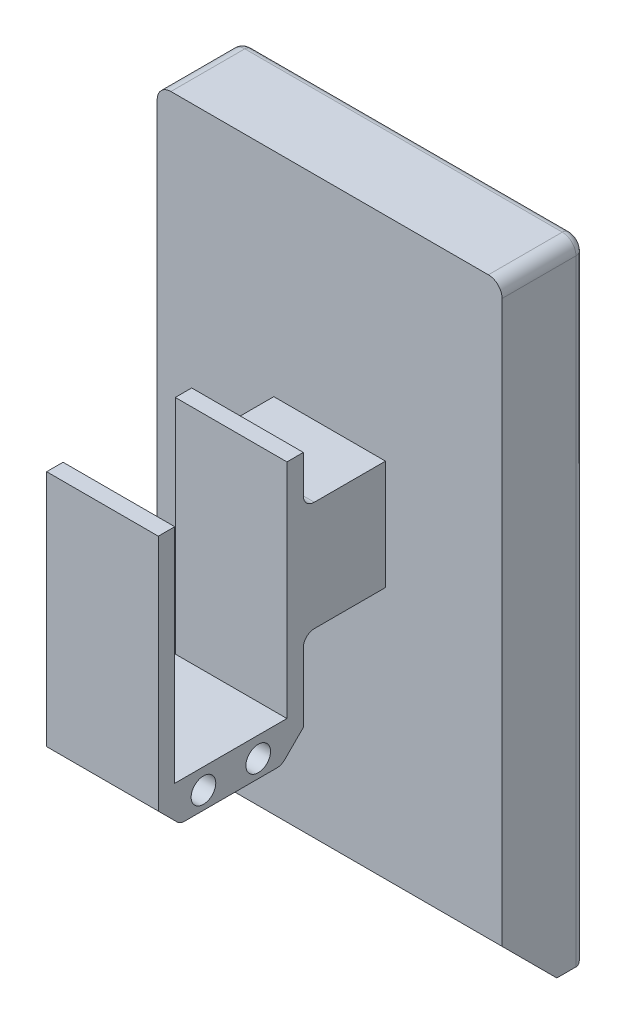
ISO-10303-21;
HEADER;
FILE_DESCRIPTION(('STEP AP214'),'2;1');
FILE_NAME('part.step','',(''),(''),'','','');
FILE_SCHEMA(('AUTOMOTIVE_DESIGN { 1 0 10303 214 1 1 1 1 }'));
ENDSEC;
DATA;
#1=APPLICATION_CONTEXT('core data for automotive mechanical design processes');
#2=APPLICATION_PROTOCOL_DEFINITION('international standard','automotive_design',2000,#1);
#3=PRODUCT_CONTEXT('',#1,'mechanical');
#4=PRODUCT('Part','Part','',(#3));
#5=PRODUCT_RELATED_PRODUCT_CATEGORY('part','',(#4));
#6=PRODUCT_DEFINITION_FORMATION('','',#4);
#7=PRODUCT_DEFINITION_CONTEXT('part definition',#1,'design');
#8=PRODUCT_DEFINITION('design','',#6,#7);
#9=PRODUCT_DEFINITION_SHAPE('','',#8);
#10=(LENGTH_UNIT() NAMED_UNIT(*) SI_UNIT(.MILLI.,.METRE.));
#11=(NAMED_UNIT(*) PLANE_ANGLE_UNIT() SI_UNIT($,.RADIAN.));
#12=(NAMED_UNIT(*) SI_UNIT($,.STERADIAN.) SOLID_ANGLE_UNIT());
#13=UNCERTAINTY_MEASURE_WITH_UNIT(LENGTH_MEASURE(1.E-05),#10,'distance_accuracy_value','');
#14=(GEOMETRIC_REPRESENTATION_CONTEXT(3) GLOBAL_UNCERTAINTY_ASSIGNED_CONTEXT((#13)) GLOBAL_UNIT_ASSIGNED_CONTEXT((#10,
#11,#12)) REPRESENTATION_CONTEXT('',''));
#15=CARTESIAN_POINT('',(0.,0.,0.));
#16=DIRECTION('',(0.,0.,1.));
#17=DIRECTION('',(1.,0.,0.));
#18=AXIS2_PLACEMENT_3D('',#15,#16,#17);
#19=CARTESIAN_POINT('',(20.,0.,-13.25));
#20=DIRECTION('',(0.,0.,1.));
#21=DIRECTION('',(0.,-1.,0.));
#22=AXIS2_PLACEMENT_3D('',#19,#20,#21);
#23=PLANE('',#22);
#24=DIRECTION('',(0.,1.,0.));
#25=VECTOR('',#24,1.);
#26=CARTESIAN_POINT('',(0.,0.,-13.25));
#27=LINE('',#26,#25);
#28=CARTESIAN_POINT('',(0.,13.423218072507,-13.25));
#29=VERTEX_POINT('',#28);
#30=CARTESIAN_POINT('',(0.,20.3,-13.25));
#31=VERTEX_POINT('',#30);
#32=EDGE_CURVE('E261',#29,#31,#27,.T.);
#33=ORIENTED_EDGE('',*,*,#32,.T.);
#34=DIRECTION('',(1.,0.,0.));
#35=VECTOR('',#34,1.);
#36=CARTESIAN_POINT('',(0.,20.3,-13.25));
#37=LINE('',#36,#35);
#38=CARTESIAN_POINT('',(20.4,20.3,-13.25));
#39=VERTEX_POINT('',#38);
#40=EDGE_CURVE('E444',#31,#39,#37,.T.);
#41=ORIENTED_EDGE('',*,*,#40,.T.);
#42=DIRECTION('',(0.,1.,0.));
#43=VECTOR('',#42,1.);
#44=CARTESIAN_POINT('',(20.4,13.423218072507,-13.25));
#45=LINE('',#44,#43);
#46=CARTESIAN_POINT('',(20.4,13.423218072507,-13.25));
#47=VERTEX_POINT('',#46);
#48=EDGE_CURVE('E427',#47,#39,#45,.T.);
#49=ORIENTED_EDGE('',*,*,#48,.F.);
#50=DIRECTION('',(1.,0.,0.));
#51=VECTOR('',#50,1.);
#52=CARTESIAN_POINT('',(20.,13.423218072507,-13.25));
#53=LINE('',#52,#51);
#54=EDGE_CURVE('E286',#47,#29,#53,.F.);
#55=ORIENTED_EDGE('',*,*,#54,.T.);
#56=EDGE_LOOP('',(#33,#41,#49,#55));
#57=FACE_BOUND('',#56,.T.);
#58=ADVANCED_FACE('F44',(#57),#23,.F.);
#59=CARTESIAN_POINT('',(0.,-23.1999999999998,-13.25));
#60=VERTEX_POINT('',#59);
#61=CARTESIAN_POINT('',(0.,-10.576781927493,-13.25));
#62=VERTEX_POINT('',#61);
#63=EDGE_CURVE('E262',#60,#62,#27,.T.);
#64=ORIENTED_EDGE('',*,*,#63,.T.);
#65=DIRECTION('',(1.,0.,0.));
#66=VECTOR('',#65,1.);
#67=CARTESIAN_POINT('',(20.,-10.576781927493,-13.25));
#68=LINE('',#67,#66);
#69=CARTESIAN_POINT('',(20.4,-10.576781927493,-13.25));
#70=VERTEX_POINT('',#69);
#71=EDGE_CURVE('E288',#62,#70,#68,.T.);
#72=ORIENTED_EDGE('',*,*,#71,.T.);
#73=DIRECTION('',(0.,1.,0.));
#74=VECTOR('',#73,1.);
#75=CARTESIAN_POINT('',(20.4,-23.1999999999998,-13.25));
#76=LINE('',#75,#74);
#77=CARTESIAN_POINT('',(20.4,-23.1999999999998,-13.25));
#78=VERTEX_POINT('',#77);
#79=EDGE_CURVE('E412',#78,#70,#76,.T.);
#80=ORIENTED_EDGE('',*,*,#79,.F.);
#81=DIRECTION('',(1.,0.,0.));
#82=VECTOR('',#81,1.);
#83=CARTESIAN_POINT('',(-27.3835717173637,-23.1999999999998,-13.25));
#84=LINE('',#83,#82);
#85=EDGE_CURVE('E453',#60,#78,#84,.T.);
#86=ORIENTED_EDGE('',*,*,#85,.F.);
#87=EDGE_LOOP('',(#64,#72,#80,#86));
#88=FACE_BOUND('',#87,.T.);
#89=ADVANCED_FACE('F499',(#88),#23,.F.);
#90=CARTESIAN_POINT('',(20.,0.,13.25));
#91=DIRECTION('',(0.,0.,1.));
#92=DIRECTION('',(1.,0.,0.));
#93=AXIS2_PLACEMENT_3D('',#90,#91,#92);
#94=PLANE('',#93);
#95=DIRECTION('',(1.,0.,0.));
#96=VECTOR('',#95,1.);
#97=CARTESIAN_POINT('',(0.,20.3,13.25));
#98=LINE('',#97,#96);
#99=CARTESIAN_POINT('',(0.,20.3,13.25));
#100=VERTEX_POINT('',#99);
#101=CARTESIAN_POINT('',(20.4,20.3,13.25));
#102=VERTEX_POINT('',#101);
#103=EDGE_CURVE('E443',#100,#102,#98,.T.);
#104=ORIENTED_EDGE('',*,*,#103,.F.);
#105=DIRECTION('',(0.,1.,0.));
#106=VECTOR('',#105,1.);
#107=CARTESIAN_POINT('',(0.,0.,13.25));
#108=LINE('',#107,#106);
#109=CARTESIAN_POINT('',(0.,-23.2,13.25));
#110=VERTEX_POINT('',#109);
#111=EDGE_CURVE('E265',#110,#100,#108,.T.);
#112=ORIENTED_EDGE('',*,*,#111,.F.);
#113=DIRECTION('',(1.,0.,0.));
#114=VECTOR('',#113,1.);
#115=CARTESIAN_POINT('',(-27.3835717173637,-23.2,13.25));
#116=LINE('',#115,#114);
#117=CARTESIAN_POINT('',(20.4,-23.2,13.25));
#118=VERTEX_POINT('',#117);
#119=EDGE_CURVE('E255',#110,#118,#116,.T.);
#120=ORIENTED_EDGE('',*,*,#119,.T.);
#121=DIRECTION('',(0.,-1.,0.));
#122=VECTOR('',#121,1.);
#123=CARTESIAN_POINT('',(20.4,20.3,13.25));
#124=LINE('',#123,#122);
#125=EDGE_CURVE('E394',#102,#118,#124,.T.);
#126=ORIENTED_EDGE('',*,*,#125,.F.);
#127=EDGE_LOOP('',(#104,#112,#120,#126));
#128=FACE_BOUND('',#127,.T.);
#129=ADVANCED_FACE('F476',(#128),#94,.T.);
#130=CARTESIAN_POINT('',(20.,0.,10.25));
#131=DIRECTION('',(0.,0.,1.));
#132=DIRECTION('',(1.,0.,0.));
#133=AXIS2_PLACEMENT_3D('',#130,#131,#132);
#134=PLANE('',#133);
#135=DIRECTION('',(0.,1.,0.));
#136=VECTOR('',#135,1.);
#137=CARTESIAN_POINT('',(0.,0.,10.25));
#138=LINE('',#137,#136);
#139=CARTESIAN_POINT('',(0.,-20.3,10.25));
#140=VERTEX_POINT('',#139);
#141=CARTESIAN_POINT('',(0.,20.3,10.25));
#142=VERTEX_POINT('',#141);
#143=EDGE_CURVE('E267',#140,#142,#138,.T.);
#144=ORIENTED_EDGE('',*,*,#143,.T.);
#145=DIRECTION('',(-1.,0.,0.));
#146=VECTOR('',#145,1.);
#147=CARTESIAN_POINT('',(20.,20.3,10.25));
#148=LINE('',#147,#146);
#149=CARTESIAN_POINT('',(20.4,20.3,10.25));
#150=VERTEX_POINT('',#149);
#151=EDGE_CURVE('E279',#150,#142,#148,.T.);
#152=ORIENTED_EDGE('',*,*,#151,.F.);
#153=DIRECTION('',(0.,1.,0.));
#154=VECTOR('',#153,1.);
#155=CARTESIAN_POINT('',(20.4,-20.3,10.25));
#156=LINE('',#155,#154);
#157=CARTESIAN_POINT('',(20.4,-20.3,10.25));
#158=VERTEX_POINT('',#157);
#159=EDGE_CURVE('E388',#158,#150,#156,.T.);
#160=ORIENTED_EDGE('',*,*,#159,.F.);
#161=DIRECTION('',(-1.,0.,0.));
#162=VECTOR('',#161,1.);
#163=CARTESIAN_POINT('',(20.,-20.3,10.25));
#164=LINE('',#163,#162);
#165=EDGE_CURVE('E281',#158,#140,#164,.T.);
#166=ORIENTED_EDGE('',*,*,#165,.T.);
#167=EDGE_LOOP('',(#144,#152,#160,#166));
#168=FACE_BOUND('',#167,.T.);
#169=ADVANCED_FACE('F649',(#168),#134,.F.);
#170=CARTESIAN_POINT('',(20.,0.,-10.25));
#171=DIRECTION('',(0.,0.,1.));
#172=DIRECTION('',(1.,0.,0.));
#173=AXIS2_PLACEMENT_3D('',#170,#171,#172);
#174=PLANE('',#173);
#175=DIRECTION('',(0.,1.,0.));
#176=VECTOR('',#175,1.);
#177=CARTESIAN_POINT('',(0.,0.,-10.25));
#178=LINE('',#177,#176);
#179=CARTESIAN_POINT('',(0.,-20.3,-10.25));
#180=VERTEX_POINT('',#179);
#181=CARTESIAN_POINT('',(0.,20.3,-10.25));
#182=VERTEX_POINT('',#181);
#183=EDGE_CURVE('E270',#180,#182,#178,.T.);
#184=ORIENTED_EDGE('',*,*,#183,.F.);
#185=DIRECTION('',(-1.,0.,0.));
#186=VECTOR('',#185,1.);
#187=CARTESIAN_POINT('',(20.,-20.3,-10.25));
#188=LINE('',#187,#186);
#189=CARTESIAN_POINT('',(20.4,-20.3,-10.25));
#190=VERTEX_POINT('',#189);
#191=EDGE_CURVE('E273',#190,#180,#188,.T.);
#192=ORIENTED_EDGE('',*,*,#191,.F.);
#193=DIRECTION('',(0.,-1.,0.));
#194=VECTOR('',#193,1.);
#195=CARTESIAN_POINT('',(20.4,20.3,-10.25));
#196=LINE('',#195,#194);
#197=CARTESIAN_POINT('',(20.4,20.3,-10.25));
#198=VERTEX_POINT('',#197);
#199=EDGE_CURVE('E433',#198,#190,#196,.T.);
#200=ORIENTED_EDGE('',*,*,#199,.F.);
#201=DIRECTION('',(-1.,0.,0.));
#202=VECTOR('',#201,1.);
#203=CARTESIAN_POINT('',(20.,20.3,-10.25));
#204=LINE('',#203,#202);
#205=EDGE_CURVE('E276',#198,#182,#204,.T.);
#206=ORIENTED_EDGE('',*,*,#205,.T.);
#207=EDGE_LOOP('',(#184,#192,#200,#206));
#208=FACE_BOUND('',#207,.T.);
#209=ADVANCED_FACE('F644',(#208),#174,.T.);
#210=CARTESIAN_POINT('',(0.,0.,0.));
#211=DIRECTION('',(1.,0.,0.));
#212=DIRECTION('',(0.,0.,-1.));
#213=AXIS2_PLACEMENT_3D('',#210,#211,#212);
#214=PLANE('',#213);
#215=ORIENTED_EDGE('',*,*,#111,.T.);
#216=DIRECTION('',(0.,0.,-1.));
#217=VECTOR('',#216,1.);
#218=CARTESIAN_POINT('',(0.,20.3,13.25));
#219=LINE('',#218,#217);
#220=EDGE_CURVE('E440',#100,#142,#219,.T.);
#221=ORIENTED_EDGE('',*,*,#220,.T.);
#222=ORIENTED_EDGE('',*,*,#143,.F.);
#223=DIRECTION('',(0.,0.,-1.));
#224=VECTOR('',#223,1.);
#225=CARTESIAN_POINT('',(0.,-20.2999999999998,-13.25));
#226=LINE('',#225,#224);
#227=EDGE_CURVE('E449',#140,#180,#226,.T.);
#228=ORIENTED_EDGE('',*,*,#227,.T.);
#229=ORIENTED_EDGE('',*,*,#183,.T.);
#230=EDGE_CURVE('E439',#182,#31,#219,.T.);
#231=ORIENTED_EDGE('',*,*,#230,.T.);
#232=ORIENTED_EDGE('',*,*,#32,.F.);
#233=CARTESIAN_POINT('',(0.,13.423218072507,-15.25));
#234=DIRECTION('',(1.,0.,0.));
#235=DIRECTION('',(0.,0.,-1.));
#236=AXIS2_PLACEMENT_3D('',#233,#234,#235);
#237=CIRCLE('',#236,2.);
#238=CARTESIAN_POINT('',(0.,11.423218072507,-15.25));
#239=VERTEX_POINT('',#238);
#240=EDGE_CURVE('E291',#29,#239,#237,.T.);
#241=ORIENTED_EDGE('',*,*,#240,.T.);
#242=DIRECTION('',(0.,0.,-1.));
#243=VECTOR('',#242,1.);
#244=CARTESIAN_POINT('',(0.,11.423218072507,-13.25));
#245=LINE('',#244,#243);
#246=CARTESIAN_POINT('',(0.,11.423218072507,-28.25));
#247=VERTEX_POINT('',#246);
#248=EDGE_CURVE('E248',#239,#247,#245,.T.);
#249=ORIENTED_EDGE('',*,*,#248,.T.);
#250=DIRECTION('',(0.,-1.,0.));
#251=VECTOR('',#250,1.);
#252=CARTESIAN_POINT('',(0.,11.423218072507,-28.25));
#253=LINE('',#252,#251);
#254=CARTESIAN_POINT('',(0.,-8.57678192749301,-28.25));
#255=VERTEX_POINT('',#254);
#256=EDGE_CURVE('E231',#247,#255,#253,.T.);
#257=ORIENTED_EDGE('',*,*,#256,.T.);
#258=DIRECTION('',(0.,0.,1.));
#259=VECTOR('',#258,1.);
#260=CARTESIAN_POINT('',(0.,-8.57678192749301,-28.25));
#261=LINE('',#260,#259);
#262=CARTESIAN_POINT('',(0.,-8.57678192749301,-15.25));
#263=VERTEX_POINT('',#262);
#264=EDGE_CURVE('E239',#255,#263,#261,.T.);
#265=ORIENTED_EDGE('',*,*,#264,.T.);
#266=CARTESIAN_POINT('',(0.,-10.576781927493,-15.25));
#267=DIRECTION('',(1.,0.,0.));
#268=DIRECTION('',(0.,0.,-1.));
#269=AXIS2_PLACEMENT_3D('',#266,#267,#268);
#270=CIRCLE('',#269,2.);
#271=EDGE_CURVE('E293',#263,#62,#270,.T.);
#272=ORIENTED_EDGE('',*,*,#271,.T.);
#273=ORIENTED_EDGE('',*,*,#63,.F.);
#274=DIRECTION('',(0.,-0.707106781186554,0.707106781186541));
#275=VECTOR('',#274,1.);
#276=CARTESIAN_POINT('',(0.,-26.6142135623729,-9.83578643762696));
#277=LINE('',#276,#275);
#278=CARTESIAN_POINT('',(0.,-26.6142135623729,-9.83578643762696));
#279=VERTEX_POINT('',#278);
#280=EDGE_CURVE('E457',#60,#279,#277,.T.);
#281=ORIENTED_EDGE('',*,*,#280,.T.);
#282=CARTESIAN_POINT('',(0.,-25.1999999999999,-8.42157287525385));
#283=DIRECTION('',(1.,0.,0.));
#284=DIRECTION('',(0.,0.,-1.));
#285=AXIS2_PLACEMENT_3D('',#282,#283,#284);
#286=CIRCLE('',#285,2.);
#287=CARTESIAN_POINT('',(0.,-27.1999999999999,-8.42157287525387));
#288=VERTEX_POINT('',#287);
#289=EDGE_CURVE('E455',#279,#288,#286,.F.);
#290=ORIENTED_EDGE('',*,*,#289,.T.);
#291=DIRECTION('',(0.,0.,1.));
#292=VECTOR('',#291,1.);
#293=CARTESIAN_POINT('',(0.,-27.1999999999999,-8.42157287525387));
#294=LINE('',#293,#292);
#295=CARTESIAN_POINT('',(0.,-27.2,8.42157287525376));
#296=VERTEX_POINT('',#295);
#297=EDGE_CURVE('E452',#288,#296,#294,.T.);
#298=ORIENTED_EDGE('',*,*,#297,.T.);
#299=CARTESIAN_POINT('',(0.,-25.2,8.42157287525377));
#300=DIRECTION('',(1.,0.,0.));
#301=DIRECTION('',(0.,0.,-1.));
#302=AXIS2_PLACEMENT_3D('',#299,#300,#301);
#303=CIRCLE('',#302,2.);
#304=CARTESIAN_POINT('',(0.,-26.6142135623731,9.83578643762685));
#305=VERTEX_POINT('',#304);
#306=EDGE_CURVE('E450',#296,#305,#303,.F.);
#307=ORIENTED_EDGE('',*,*,#306,.T.);
#308=DIRECTION('',(0.,0.707106781186541,0.707106781186554));
#309=VECTOR('',#308,1.);
#310=CARTESIAN_POINT('',(0.,-23.2,13.25));
#311=LINE('',#310,#309);
#312=EDGE_CURVE('E259',#305,#110,#311,.T.);
#313=ORIENTED_EDGE('',*,*,#312,.T.);
#314=EDGE_LOOP('',(#215,#221,#222,#228,#229,#231,#232,#241,#249,#257,#265,#272,#273,#281,#290,
#298,#307,#313));
#315=FACE_BOUND('',#314,.T.);
#316=ADVANCED_FACE('F245',(#315),#214,.F.);
#317=CARTESIAN_POINT('',(-25.,-8.57678192749301,-28.25));
#318=DIRECTION('',(0.,-1.,0.));
#319=DIRECTION('',(0.,0.,-1.));
#320=AXIS2_PLACEMENT_3D('',#317,#318,#319);
#321=PLANE('',#320);
#322=DIRECTION('',(1.,0.,0.));
#323=VECTOR('',#322,1.);
#324=CARTESIAN_POINT('',(-25.,-8.57678192749301,-28.25));
#325=LINE('',#324,#323);
#326=CARTESIAN_POINT('',(20.4,-8.57678192749301,-28.25));
#327=VERTEX_POINT('',#326);
#328=EDGE_CURVE('E228',#255,#327,#325,.T.);
#329=ORIENTED_EDGE('',*,*,#328,.T.);
#330=DIRECTION('',(0.,0.,-1.));
#331=VECTOR('',#330,1.);
#332=CARTESIAN_POINT('',(20.4,-8.57678192749301,-15.25));
#333=LINE('',#332,#331);
#334=CARTESIAN_POINT('',(20.4,-8.57678192749301,-15.25));
#335=VERTEX_POINT('',#334);
#336=EDGE_CURVE('E418',#335,#327,#333,.T.);
#337=ORIENTED_EDGE('',*,*,#336,.F.);
#338=DIRECTION('',(1.,0.,0.));
#339=VECTOR('',#338,1.);
#340=CARTESIAN_POINT('',(-25.,-8.57678192749301,-15.25));
#341=LINE('',#340,#339);
#342=EDGE_CURVE('E252',#335,#263,#341,.F.);
#343=ORIENTED_EDGE('',*,*,#342,.T.);
#344=ORIENTED_EDGE('',*,*,#264,.F.);
#345=EDGE_LOOP('',(#329,#337,#343,#344));
#346=FACE_BOUND('',#345,.T.);
#347=ADVANCED_FACE('F251',(#346),#321,.T.);
#348=CARTESIAN_POINT('',(-25.,11.423218072507,-13.25));
#349=DIRECTION('',(0.,1.,0.));
#350=DIRECTION('',(0.,0.,1.));
#351=AXIS2_PLACEMENT_3D('',#348,#349,#350);
#352=PLANE('',#351);
#353=ORIENTED_EDGE('',*,*,#248,.F.);
#354=DIRECTION('',(1.,0.,0.));
#355=VECTOR('',#354,1.);
#356=CARTESIAN_POINT('',(-25.,11.423218072507,-15.25));
#357=LINE('',#356,#355);
#358=CARTESIAN_POINT('',(20.4,11.423218072507,-15.25));
#359=VERTEX_POINT('',#358);
#360=EDGE_CURVE('E284',#239,#359,#357,.T.);
#361=ORIENTED_EDGE('',*,*,#360,.T.);
#362=DIRECTION('',(0.,0.,1.));
#363=VECTOR('',#362,1.);
#364=CARTESIAN_POINT('',(20.4,11.423218072507,-28.25));
#365=LINE('',#364,#363);
#366=CARTESIAN_POINT('',(20.4,11.423218072507,-28.25));
#367=VERTEX_POINT('',#366);
#368=EDGE_CURVE('E421',#367,#359,#365,.T.);
#369=ORIENTED_EDGE('',*,*,#368,.F.);
#370=DIRECTION('',(1.,0.,0.));
#371=VECTOR('',#370,1.);
#372=CARTESIAN_POINT('',(-25.,11.423218072507,-28.25));
#373=LINE('',#372,#371);
#374=EDGE_CURVE('E240',#247,#367,#373,.T.);
#375=ORIENTED_EDGE('',*,*,#374,.F.);
#376=EDGE_LOOP('',(#353,#361,#369,#375));
#377=FACE_BOUND('',#376,.T.);
#378=ADVANCED_FACE('F513',(#377),#352,.T.);
#379=CARTESIAN_POINT('',(-25.,13.423218072507,-15.25));
#380=DIRECTION('',(1.,0.,0.));
#381=DIRECTION('',(0.,0.,-1.));
#382=AXIS2_PLACEMENT_3D('',#379,#380,#381);
#383=CYLINDRICAL_SURFACE('',#382,2.);
#384=ORIENTED_EDGE('',*,*,#240,.F.);
#385=ORIENTED_EDGE('',*,*,#54,.F.);
#386=CARTESIAN_POINT('',(20.4,13.423218072507,-15.25));
#387=DIRECTION('',(-1.,0.,0.));
#388=DIRECTION('',(0.,0.,-1.));
#389=AXIS2_PLACEMENT_3D('',#386,#387,#388);
#390=CIRCLE('',#389,2.);
#391=EDGE_CURVE('E424',#359,#47,#390,.T.);
#392=ORIENTED_EDGE('',*,*,#391,.F.);
#393=ORIENTED_EDGE('',*,*,#360,.F.);
#394=EDGE_LOOP('',(#384,#385,#392,#393));
#395=FACE_BOUND('',#394,.T.);
#396=ADVANCED_FACE('F510',(#395),#383,.F.);
#397=CARTESIAN_POINT('',(20.,-10.576781927493,-15.25));
#398=DIRECTION('',(1.,0.,0.));
#399=DIRECTION('',(0.,0.,-1.));
#400=AXIS2_PLACEMENT_3D('',#397,#398,#399);
#401=CYLINDRICAL_SURFACE('',#400,2.);
#402=ORIENTED_EDGE('',*,*,#271,.F.);
#403=ORIENTED_EDGE('',*,*,#342,.F.);
#404=CARTESIAN_POINT('',(20.4,-10.576781927493,-15.25));
#405=DIRECTION('',(-1.,0.,0.));
#406=DIRECTION('',(0.,0.,-1.));
#407=AXIS2_PLACEMENT_3D('',#404,#405,#406);
#408=CIRCLE('',#407,2.);
#409=EDGE_CURVE('E415',#70,#335,#408,.T.);
#410=ORIENTED_EDGE('',*,*,#409,.F.);
#411=ORIENTED_EDGE('',*,*,#71,.F.);
#412=EDGE_LOOP('',(#402,#403,#410,#411));
#413=FACE_BOUND('',#412,.T.);
#414=ADVANCED_FACE('F494',(#413),#401,.F.);
#415=CARTESIAN_POINT('',(-27.3835717173637,-20.2999999999998,-13.25));
#416=DIRECTION('',(0.,1.,0.));
#417=DIRECTION('',(0.,0.,1.));
#418=AXIS2_PLACEMENT_3D('',#415,#416,#417);
#419=PLANE('',#418);
#420=ORIENTED_EDGE('',*,*,#165,.F.);
#421=DIRECTION('',(0.,0.,1.));
#422=VECTOR('',#421,1.);
#423=CARTESIAN_POINT('',(20.4,-20.3,-10.25));
#424=LINE('',#423,#422);
#425=EDGE_CURVE('E436',#190,#158,#424,.T.);
#426=ORIENTED_EDGE('',*,*,#425,.F.);
#427=ORIENTED_EDGE('',*,*,#191,.T.);
#428=ORIENTED_EDGE('',*,*,#227,.F.);
#429=EDGE_LOOP('',(#420,#426,#427,#428));
#430=FACE_BOUND('',#429,.T.);
#431=ADVANCED_FACE('F485',(#430),#419,.T.);
#432=CARTESIAN_POINT('',(-27.3835717173637,-23.2,13.25));
#433=DIRECTION('',(0.,-0.707106781186554,0.707106781186541));
#434=DIRECTION('',(0.,-0.707106781186541,-0.707106781186554));
#435=AXIS2_PLACEMENT_3D('',#432,#433,#434);
#436=PLANE('',#435);
#437=ORIENTED_EDGE('',*,*,#312,.F.);
#438=DIRECTION('',(1.,0.,0.));
#439=VECTOR('',#438,1.);
#440=CARTESIAN_POINT('',(-27.3835717173637,-26.6142135623731,9.83578643762685));
#441=LINE('',#440,#439);
#442=CARTESIAN_POINT('',(20.4,-26.6142135623731,9.83578643762685));
#443=VERTEX_POINT('',#442);
#444=EDGE_CURVE('E467',#305,#443,#441,.T.);
#445=ORIENTED_EDGE('',*,*,#444,.T.);
#446=DIRECTION('',(0.,-0.707106781186541,-0.707106781186554));
#447=VECTOR('',#446,1.);
#448=CARTESIAN_POINT('',(20.4,-23.2,13.25));
#449=LINE('',#448,#447);
#450=EDGE_CURVE('E397',#118,#443,#449,.T.);
#451=ORIENTED_EDGE('',*,*,#450,.F.);
#452=ORIENTED_EDGE('',*,*,#119,.F.);
#453=EDGE_LOOP('',(#437,#445,#451,#452));
#454=FACE_BOUND('',#453,.T.);
#455=ADVANCED_FACE('F482',(#454),#436,.T.);
#456=CARTESIAN_POINT('',(-27.3835717173637,-25.2,8.42157287525377));
#457=DIRECTION('',(1.,0.,0.));
#458=DIRECTION('',(0.,0.,-1.));
#459=AXIS2_PLACEMENT_3D('',#456,#457,#458);
#460=CYLINDRICAL_SURFACE('',#459,2.);
#461=ORIENTED_EDGE('',*,*,#306,.F.);
#462=DIRECTION('',(1.,0.,0.));
#463=VECTOR('',#462,1.);
#464=CARTESIAN_POINT('',(-27.3835717173637,-27.2,8.42157287525376));
#465=LINE('',#464,#463);
#466=CARTESIAN_POINT('',(20.4,-27.2,8.42157287525376));
#467=VERTEX_POINT('',#466);
#468=EDGE_CURVE('E466',#296,#467,#465,.T.);
#469=ORIENTED_EDGE('',*,*,#468,.T.);
#470=CARTESIAN_POINT('',(20.4,-25.2,8.42157287525377));
#471=DIRECTION('',(1.,0.,0.));
#472=DIRECTION('',(0.,0.,-1.));
#473=AXIS2_PLACEMENT_3D('',#470,#471,#472);
#474=CIRCLE('',#473,2.);
#475=EDGE_CURVE('E400',#443,#467,#474,.T.);
#476=ORIENTED_EDGE('',*,*,#475,.F.);
#477=ORIENTED_EDGE('',*,*,#444,.F.);
#478=EDGE_LOOP('',(#461,#469,#476,#477));
#479=FACE_BOUND('',#478,.T.);
#480=ADVANCED_FACE('F484',(#479),#460,.T.);
#481=CARTESIAN_POINT('',(-27.3835717173637,-27.1999999999999,-8.42157287525387));
#482=DIRECTION('',(0.,-1.,0.));
#483=DIRECTION('',(0.,0.,-1.));
#484=AXIS2_PLACEMENT_3D('',#481,#482,#483);
#485=PLANE('',#484);
#486=ORIENTED_EDGE('',*,*,#297,.F.);
#487=DIRECTION('',(1.,0.,0.));
#488=VECTOR('',#487,1.);
#489=CARTESIAN_POINT('',(-27.3835717173637,-27.1999999999999,-8.42157287525387));
#490=LINE('',#489,#488);
#491=CARTESIAN_POINT('',(20.4,-27.1999999999999,-8.42157287525387));
#492=VERTEX_POINT('',#491);
#493=EDGE_CURVE('E464',#288,#492,#490,.T.);
#494=ORIENTED_EDGE('',*,*,#493,.T.);
#495=DIRECTION('',(0.,0.,-1.));
#496=VECTOR('',#495,1.);
#497=CARTESIAN_POINT('',(20.4,-27.2,8.42157287525376));
#498=LINE('',#497,#496);
#499=EDGE_CURVE('E403',#467,#492,#498,.T.);
#500=ORIENTED_EDGE('',*,*,#499,.F.);
#501=ORIENTED_EDGE('',*,*,#468,.F.);
#502=EDGE_LOOP('',(#486,#494,#500,#501));
#503=FACE_BOUND('',#502,.T.);
#504=ADVANCED_FACE('F491',(#503),#485,.T.);
#505=CARTESIAN_POINT('',(-27.3835717173637,-25.1999999999999,-8.42157287525385));
#506=DIRECTION('',(1.,0.,0.));
#507=DIRECTION('',(0.,0.,-1.));
#508=AXIS2_PLACEMENT_3D('',#505,#506,#507);
#509=CYLINDRICAL_SURFACE('',#508,2.);
#510=ORIENTED_EDGE('',*,*,#289,.F.);
#511=DIRECTION('',(1.,0.,0.));
#512=VECTOR('',#511,1.);
#513=CARTESIAN_POINT('',(-27.3835717173637,-26.6142135623729,-9.83578643762696));
#514=LINE('',#513,#512);
#515=CARTESIAN_POINT('',(20.4,-26.6142135623729,-9.83578643762695));
#516=VERTEX_POINT('',#515);
#517=EDGE_CURVE('E462',#279,#516,#514,.T.);
#518=ORIENTED_EDGE('',*,*,#517,.T.);
#519=CARTESIAN_POINT('',(20.4,-25.1999999999999,-8.42157287525385));
#520=DIRECTION('',(1.,0.,0.));
#521=DIRECTION('',(0.,0.,-1.));
#522=AXIS2_PLACEMENT_3D('',#519,#520,#521);
#523=CIRCLE('',#522,2.);
#524=EDGE_CURVE('E406',#492,#516,#523,.T.);
#525=ORIENTED_EDGE('',*,*,#524,.F.);
#526=ORIENTED_EDGE('',*,*,#493,.F.);
#527=EDGE_LOOP('',(#510,#518,#525,#526));
#528=FACE_BOUND('',#527,.T.);
#529=ADVANCED_FACE('F610',(#528),#509,.T.);
#530=CARTESIAN_POINT('',(-27.3835717173637,-26.6142135623729,-9.83578643762696));
#531=DIRECTION('',(0.,-0.707106781186541,-0.707106781186554));
#532=DIRECTION('',(0.,0.707106781186554,-0.707106781186541));
#533=AXIS2_PLACEMENT_3D('',#530,#531,#532);
#534=PLANE('',#533);
#535=ORIENTED_EDGE('',*,*,#280,.F.);
#536=ORIENTED_EDGE('',*,*,#85,.T.);
#537=DIRECTION('',(0.,0.707106781186554,-0.707106781186541));
#538=VECTOR('',#537,1.);
#539=CARTESIAN_POINT('',(20.4,-26.6142135623729,-9.83578643762696));
#540=LINE('',#539,#538);
#541=EDGE_CURVE('E409',#516,#78,#540,.T.);
#542=ORIENTED_EDGE('',*,*,#541,.F.);
#543=ORIENTED_EDGE('',*,*,#517,.F.);
#544=EDGE_LOOP('',(#535,#536,#542,#543));
#545=FACE_BOUND('',#544,.T.);
#546=ADVANCED_FACE('F600',(#545),#534,.T.);
#547=CARTESIAN_POINT('',(0.,20.3,13.25));
#548=DIRECTION('',(0.,-1.,0.));
#549=DIRECTION('',(0.,0.,-1.));
#550=AXIS2_PLACEMENT_3D('',#547,#548,#549);
#551=PLANE('',#550);
#552=ORIENTED_EDGE('',*,*,#205,.F.);
#553=DIRECTION('',(0.,0.,1.));
#554=VECTOR('',#553,1.);
#555=CARTESIAN_POINT('',(20.4,20.3,-13.25));
#556=LINE('',#555,#554);
#557=EDGE_CURVE('E430',#39,#198,#556,.T.);
#558=ORIENTED_EDGE('',*,*,#557,.F.);
#559=ORIENTED_EDGE('',*,*,#40,.F.);
#560=ORIENTED_EDGE('',*,*,#230,.F.);
#561=EDGE_LOOP('',(#552,#558,#559,#560));
#562=FACE_BOUND('',#561,.T.);
#563=ADVANCED_FACE('F597',(#562),#551,.F.);
#564=ORIENTED_EDGE('',*,*,#220,.F.);
#565=ORIENTED_EDGE('',*,*,#103,.T.);
#566=DIRECTION('',(0.,0.,1.));
#567=VECTOR('',#566,1.);
#568=CARTESIAN_POINT('',(20.4,20.3,10.25));
#569=LINE('',#568,#567);
#570=EDGE_CURVE('E391',#150,#102,#569,.T.);
#571=ORIENTED_EDGE('',*,*,#570,.F.);
#572=ORIENTED_EDGE('',*,*,#151,.T.);
#573=EDGE_LOOP('',(#564,#565,#571,#572));
#574=FACE_BOUND('',#573,.T.);
#575=ADVANCED_FACE('F587',(#574),#551,.F.);
#576=CARTESIAN_POINT('',(20.4,-25.2,8.42157287525377));
#577=DIRECTION('',(1.,0.,0.));
#578=DIRECTION('',(0.,0.,-1.));
#579=AXIS2_PLACEMENT_3D('',#576,#577,#578);
#580=PLANE('',#579);
#581=CARTESIAN_POINT('',(20.4,-23.9999999999999,-5.00000000000001));
#582=DIRECTION('',(1.,0.,0.));
#583=DIRECTION('',(0.,0.,-1.));
#584=AXIS2_PLACEMENT_3D('',#581,#582,#583);
#585=CIRCLE('',#584,2.25);
#586=CARTESIAN_POINT('',(20.4,-23.9999999999999,-7.25000000000002));
#587=VERTEX_POINT('',#586);
#588=EDGE_CURVE('E385',#587,#587,#585,.T.);
#589=ORIENTED_EDGE('',*,*,#588,.F.);
#590=EDGE_LOOP('',(#589));
#591=FACE_BOUND('',#590,.T.);
#592=ORIENTED_EDGE('',*,*,#159,.T.);
#593=ORIENTED_EDGE('',*,*,#570,.T.);
#594=ORIENTED_EDGE('',*,*,#125,.T.);
#595=ORIENTED_EDGE('',*,*,#450,.T.);
#596=ORIENTED_EDGE('',*,*,#475,.T.);
#597=ORIENTED_EDGE('',*,*,#499,.T.);
#598=ORIENTED_EDGE('',*,*,#524,.T.);
#599=ORIENTED_EDGE('',*,*,#541,.T.);
#600=ORIENTED_EDGE('',*,*,#79,.T.);
#601=ORIENTED_EDGE('',*,*,#409,.T.);
#602=ORIENTED_EDGE('',*,*,#336,.T.);
#603=DIRECTION('',(0.,1.,0.));
#604=VECTOR('',#603,1.);
#605=CARTESIAN_POINT('',(20.4,-8.57678192749301,-28.25));
#606=LINE('',#605,#604);
#607=EDGE_CURVE('E234',#327,#367,#606,.T.);
#608=ORIENTED_EDGE('',*,*,#607,.T.);
#609=ORIENTED_EDGE('',*,*,#368,.T.);
#610=ORIENTED_EDGE('',*,*,#391,.T.);
#611=ORIENTED_EDGE('',*,*,#48,.T.);
#612=ORIENTED_EDGE('',*,*,#557,.T.);
#613=ORIENTED_EDGE('',*,*,#199,.T.);
#614=ORIENTED_EDGE('',*,*,#425,.T.);
#615=EDGE_LOOP('',(#592,#593,#594,#595,#596,#597,#598,#599,#600,#601,#602,#608,#609,#610,#611,
#612,#613,#614));
#616=FACE_BOUND('',#615,.T.);
#617=CARTESIAN_POINT('',(20.4,-23.9999999999999,4.99999999999999));
#618=DIRECTION('',(1.,0.,0.));
#619=DIRECTION('',(0.,0.,-1.));
#620=AXIS2_PLACEMENT_3D('',#617,#618,#619);
#621=CIRCLE('',#620,2.25000000000001);
#622=CARTESIAN_POINT('',(20.4,-23.9999999999999,2.74999999999998));
#623=VERTEX_POINT('',#622);
#624=EDGE_CURVE('E382',#623,#623,#621,.T.);
#625=ORIENTED_EDGE('',*,*,#624,.F.);
#626=EDGE_LOOP('',(#625));
#627=FACE_BOUND('',#626,.T.);
#628=ADVANCED_FACE('F478',(#591,#616,#627),#580,.T.);
#629=CARTESIAN_POINT('',(10.,-23.9999999999999,4.99999999999999));
#630=DIRECTION('',(-1.,0.,0.));
#631=DIRECTION('',(0.,0.,1.));
#632=AXIS2_PLACEMENT_3D('',#629,#630,#631);
#633=PLANE('',#632);
#634=CARTESIAN_POINT('',(10.,-23.9999999999999,4.99999999999999));
#635=DIRECTION('',(-1.,0.,0.));
#636=DIRECTION('',(0.,0.,1.));
#637=AXIS2_PLACEMENT_3D('',#634,#635,#636);
#638=CIRCLE('',#637,2.25000000000001);
#639=CARTESIAN_POINT('',(10.,-23.9999999999999,7.24999999999999));
#640=VERTEX_POINT('',#639);
#641=EDGE_CURVE('E298',#640,#640,#638,.F.);
#642=ORIENTED_EDGE('',*,*,#641,.T.);
#643=EDGE_LOOP('',(#642));
#644=FACE_BOUND('',#643,.T.);
#645=ADVANCED_FACE('F586',(#644),#633,.F.);
#646=CARTESIAN_POINT('',(-27.3835717173637,-23.9999999999999,4.99999999999999));
#647=DIRECTION('',(1.,0.,0.));
#648=DIRECTION('',(0.,0.,-1.));
#649=AXIS2_PLACEMENT_3D('',#646,#647,#648);
#650=CYLINDRICAL_SURFACE('',#649,2.25000000000001);
#651=ORIENTED_EDGE('',*,*,#641,.F.);
#652=EDGE_LOOP('',(#651));
#653=FACE_BOUND('',#652,.T.);
#654=ORIENTED_EDGE('',*,*,#624,.T.);
#655=EDGE_LOOP('',(#654));
#656=FACE_BOUND('',#655,.T.);
#657=ADVANCED_FACE('F591',(#653,#656),#650,.F.);
#658=CARTESIAN_POINT('',(10.,-23.9999999999999,-5.00000000000001));
#659=DIRECTION('',(-1.,0.,0.));
#660=DIRECTION('',(0.,0.,1.));
#661=AXIS2_PLACEMENT_3D('',#658,#659,#660);
#662=PLANE('',#661);
#663=CARTESIAN_POINT('',(10.,-23.9999999999999,-5.00000000000001));
#664=DIRECTION('',(-1.,0.,0.));
#665=DIRECTION('',(0.,0.,1.));
#666=AXIS2_PLACEMENT_3D('',#663,#664,#665);
#667=CIRCLE('',#666,2.25);
#668=CARTESIAN_POINT('',(10.,-23.9999999999999,-2.75000000000001));
#669=VERTEX_POINT('',#668);
#670=EDGE_CURVE('E295',#669,#669,#667,.F.);
#671=ORIENTED_EDGE('',*,*,#670,.T.);
#672=EDGE_LOOP('',(#671));
#673=FACE_BOUND('',#672,.T.);
#674=ADVANCED_FACE('F593',(#673),#662,.F.);
#675=CARTESIAN_POINT('',(-27.3835717173637,-23.9999999999999,-5.00000000000001));
#676=DIRECTION('',(1.,0.,0.));
#677=DIRECTION('',(0.,0.,-1.));
#678=AXIS2_PLACEMENT_3D('',#675,#676,#677);
#679=CYLINDRICAL_SURFACE('',#678,2.25);
#680=ORIENTED_EDGE('',*,*,#670,.F.);
#681=EDGE_LOOP('',(#680));
#682=FACE_BOUND('',#681,.T.);
#683=ORIENTED_EDGE('',*,*,#588,.T.);
#684=EDGE_LOOP('',(#683));
#685=FACE_BOUND('',#684,.T.);
#686=ADVANCED_FACE('F580',(#682,#685),#679,.F.);
#687=CARTESIAN_POINT('',(0.,0.,-28.25));
#688=DIRECTION('',(0.,0.,1.));
#689=DIRECTION('',(0.,-1.,0.));
#690=AXIS2_PLACEMENT_3D('',#687,#688,#689);
#691=PLANE('',#690);
#692=DIRECTION('',(1.,0.,0.));
#693=VECTOR('',#692,1.);
#694=CARTESIAN_POINT('',(41.7,50.3,-28.25));
#695=LINE('',#694,#693);
#696=CARTESIAN_POINT('',(-18.8,50.3,-28.25));
#697=VERTEX_POINT('',#696);
#698=CARTESIAN_POINT('',(39.2,50.3,-28.25));
#699=VERTEX_POINT('',#698);
#700=EDGE_CURVE('E373',#697,#699,#695,.T.);
#701=ORIENTED_EDGE('',*,*,#700,.F.);
#702=CARTESIAN_POINT('',(-18.8,47.8,-28.25));
#703=DIRECTION('',(0.,0.,1.));
#704=DIRECTION('',(0.,-1.,0.));
#705=AXIS2_PLACEMENT_3D('',#702,#703,#704);
#706=CIRCLE('',#705,2.5);
#707=CARTESIAN_POINT('',(-21.3,47.8,-28.25));
#708=VERTEX_POINT('',#707);
#709=EDGE_CURVE('E319',#697,#708,#706,.T.);
#710=ORIENTED_EDGE('',*,*,#709,.T.);
#711=DIRECTION('',(0.,1.,0.));
#712=VECTOR('',#711,1.);
#713=CARTESIAN_POINT('',(-21.3,-64.7,-28.25));
#714=LINE('',#713,#712);
#715=CARTESIAN_POINT('',(-21.3,-54.6999999999999,-28.25));
#716=VERTEX_POINT('',#715);
#717=EDGE_CURVE('E369',#716,#708,#714,.T.);
#718=ORIENTED_EDGE('',*,*,#717,.F.);
#719=DIRECTION('',(1.,0.,0.));
#720=VECTOR('',#719,1.);
#721=CARTESIAN_POINT('',(41.7,-54.6999999999999,-28.25));
#722=LINE('',#721,#720);
#723=CARTESIAN_POINT('',(41.7,-54.6999999999999,-28.25));
#724=VERTEX_POINT('',#723);
#725=EDGE_CURVE('E306',#716,#724,#722,.T.);
#726=ORIENTED_EDGE('',*,*,#725,.T.);
#727=DIRECTION('',(0.,-1.,0.));
#728=VECTOR('',#727,1.);
#729=CARTESIAN_POINT('',(41.7,-64.7,-28.25));
#730=LINE('',#729,#728);
#731=CARTESIAN_POINT('',(41.7,47.8,-28.25));
#732=VERTEX_POINT('',#731);
#733=EDGE_CURVE('E365',#732,#724,#730,.T.);
#734=ORIENTED_EDGE('',*,*,#733,.F.);
#735=CARTESIAN_POINT('',(39.2,47.8,-28.25));
#736=DIRECTION('',(0.,0.,1.));
#737=DIRECTION('',(0.,-1.,0.));
#738=AXIS2_PLACEMENT_3D('',#735,#736,#737);
#739=CIRCLE('',#738,2.5);
#740=EDGE_CURVE('E317',#732,#699,#739,.T.);
#741=ORIENTED_EDGE('',*,*,#740,.T.);
#742=EDGE_LOOP('',(#701,#710,#718,#726,#734,#741));
#743=FACE_BOUND('',#742,.T.);
#744=ORIENTED_EDGE('',*,*,#256,.F.);
#745=ORIENTED_EDGE('',*,*,#374,.T.);
#746=ORIENTED_EDGE('',*,*,#607,.F.);
#747=ORIENTED_EDGE('',*,*,#328,.F.);
#748=EDGE_LOOP('',(#744,#745,#746,#747));
#749=FACE_BOUND('',#748,.T.);
#750=ADVANCED_FACE('F230',(#743,#749),#691,.T.);
#751=CARTESIAN_POINT('',(41.7,-64.7,-43.25));
#752=DIRECTION('',(-1.,0.,0.));
#753=DIRECTION('',(0.,-1.,0.));
#754=AXIS2_PLACEMENT_3D('',#751,#752,#753);
#755=PLANE('',#754);
#756=DIRECTION('',(0.,0.,1.));
#757=VECTOR('',#756,1.);
#758=CARTESIAN_POINT('',(41.7,-64.7,-43.25));
#759=LINE('',#758,#757);
#760=CARTESIAN_POINT('',(41.7,-64.7,-41.75));
#761=VERTEX_POINT('',#760);
#762=CARTESIAN_POINT('',(41.7,-64.7,-38.25));
#763=VERTEX_POINT('',#762);
#764=EDGE_CURVE('E380',#761,#763,#759,.T.);
#765=ORIENTED_EDGE('',*,*,#764,.F.);
#766=DIRECTION('',(0.,-1.,0.));
#767=VECTOR('',#766,1.);
#768=CARTESIAN_POINT('',(41.7,-64.7,-41.75));
#769=LINE('',#768,#767);
#770=CARTESIAN_POINT('',(41.7,47.8,-41.75));
#771=VERTEX_POINT('',#770);
#772=EDGE_CURVE('E11',#761,#771,#769,.F.);
#773=ORIENTED_EDGE('',*,*,#772,.T.);
#774=DIRECTION('',(0.,0.,1.));
#775=VECTOR('',#774,1.);
#776=CARTESIAN_POINT('',(41.7,47.8,-43.25));
#777=LINE('',#776,#775);
#778=EDGE_CURVE('E324',#771,#732,#777,.T.);
#779=ORIENTED_EDGE('',*,*,#778,.T.);
#780=ORIENTED_EDGE('',*,*,#733,.T.);
#781=DIRECTION('',(0.,-0.707106781186549,-0.707106781186546));
#782=VECTOR('',#781,1.);
#783=CARTESIAN_POINT('',(41.7,-64.7,-38.25));
#784=LINE('',#783,#782);
#785=EDGE_CURVE('E309',#724,#763,#784,.T.);
#786=ORIENTED_EDGE('',*,*,#785,.T.);
#787=EDGE_LOOP('',(#765,#773,#779,#780,#786));
#788=FACE_BOUND('',#787,.T.);
#789=ADVANCED_FACE('F570',(#788),#755,.F.);
#790=CARTESIAN_POINT('',(41.7,-64.7,-43.25));
#791=DIRECTION('',(0.,1.,0.));
#792=DIRECTION('',(0.,0.,1.));
#793=AXIS2_PLACEMENT_3D('',#790,#791,#792);
#794=PLANE('',#793);
#795=DIRECTION('',(0.,0.,1.));
#796=VECTOR('',#795,1.);
#797=CARTESIAN_POINT('',(-21.3,-64.7,-43.25));
#798=LINE('',#797,#796);
#799=CARTESIAN_POINT('',(-21.3,-64.7,-41.75));
#800=VERTEX_POINT('',#799);
#801=CARTESIAN_POINT('',(-21.3,-64.7,-38.25));
#802=VERTEX_POINT('',#801);
#803=EDGE_CURVE('E378',#800,#802,#798,.T.);
#804=ORIENTED_EDGE('',*,*,#803,.F.);
#805=DIRECTION('',(-1.,0.,0.));
#806=VECTOR('',#805,1.);
#807=CARTESIAN_POINT('',(41.7,-64.7,-41.75));
#808=LINE('',#807,#806);
#809=EDGE_CURVE('E53',#800,#761,#808,.F.);
#810=ORIENTED_EDGE('',*,*,#809,.T.);
#811=ORIENTED_EDGE('',*,*,#764,.T.);
#812=DIRECTION('',(-1.,0.,0.));
#813=VECTOR('',#812,1.);
#814=CARTESIAN_POINT('',(-21.3,-64.7,-38.25));
#815=LINE('',#814,#813);
#816=EDGE_CURVE('E301',#763,#802,#815,.T.);
#817=ORIENTED_EDGE('',*,*,#816,.T.);
#818=EDGE_LOOP('',(#804,#810,#811,#817));
#819=FACE_BOUND('',#818,.T.);
#820=ADVANCED_FACE('F572',(#819),#794,.F.);
#821=CARTESIAN_POINT('',(-21.3,-64.7,-43.25));
#822=DIRECTION('',(1.,0.,0.));
#823=DIRECTION('',(0.,1.,0.));
#824=AXIS2_PLACEMENT_3D('',#821,#822,#823);
#825=PLANE('',#824);
#826=DIRECTION('',(0.,0.,1.));
#827=VECTOR('',#826,1.);
#828=CARTESIAN_POINT('',(-21.3,47.8,-43.25));
#829=LINE('',#828,#827);
#830=CARTESIAN_POINT('',(-21.3,47.8,-41.75));
#831=VERTEX_POINT('',#830);
#832=EDGE_CURVE('E321',#708,#831,#829,.F.);
#833=ORIENTED_EDGE('',*,*,#832,.T.);
#834=DIRECTION('',(0.,1.,0.));
#835=VECTOR('',#834,1.);
#836=CARTESIAN_POINT('',(-21.3,-64.7,-41.75));
#837=LINE('',#836,#835);
#838=EDGE_CURVE('E339',#831,#800,#837,.F.);
#839=ORIENTED_EDGE('',*,*,#838,.T.);
#840=ORIENTED_EDGE('',*,*,#803,.T.);
#841=DIRECTION('',(0.,0.707106781186549,0.707106781186546));
#842=VECTOR('',#841,1.);
#843=CARTESIAN_POINT('',(-21.3,-64.7,-38.25));
#844=LINE('',#843,#842);
#845=EDGE_CURVE('E304',#802,#716,#844,.T.);
#846=ORIENTED_EDGE('',*,*,#845,.T.);
#847=ORIENTED_EDGE('',*,*,#717,.T.);
#848=EDGE_LOOP('',(#833,#839,#840,#846,#847));
#849=FACE_BOUND('',#848,.T.);
#850=ADVANCED_FACE('F578',(#849),#825,.F.);
#851=CARTESIAN_POINT('',(41.7,50.3,-43.25));
#852=DIRECTION('',(0.,-1.,0.));
#853=DIRECTION('',(0.,0.,-1.));
#854=AXIS2_PLACEMENT_3D('',#851,#852,#853);
#855=PLANE('',#854);
#856=DIRECTION('',(0.,0.,1.));
#857=VECTOR('',#856,1.);
#858=CARTESIAN_POINT('',(39.2,50.3,-43.25));
#859=LINE('',#858,#857);
#860=CARTESIAN_POINT('',(39.2,50.3,-41.75));
#861=VERTEX_POINT('',#860);
#862=EDGE_CURVE('E312',#699,#861,#859,.F.);
#863=ORIENTED_EDGE('',*,*,#862,.T.);
#864=DIRECTION('',(1.,0.,0.));
#865=VECTOR('',#864,1.);
#866=CARTESIAN_POINT('',(41.7,50.3,-41.75));
#867=LINE('',#866,#865);
#868=CARTESIAN_POINT('',(-18.8,50.3,-41.75));
#869=VERTEX_POINT('',#868);
#870=EDGE_CURVE('E344',#861,#869,#867,.F.);
#871=ORIENTED_EDGE('',*,*,#870,.T.);
#872=DIRECTION('',(0.,0.,1.));
#873=VECTOR('',#872,1.);
#874=CARTESIAN_POINT('',(-18.8,50.3,-43.25));
#875=LINE('',#874,#873);
#876=EDGE_CURVE('E315',#869,#697,#875,.T.);
#877=ORIENTED_EDGE('',*,*,#876,.T.);
#878=ORIENTED_EDGE('',*,*,#700,.T.);
#879=EDGE_LOOP('',(#863,#871,#877,#878));
#880=FACE_BOUND('',#879,.T.);
#881=ADVANCED_FACE('F562',(#880),#855,.F.);
#882=CARTESIAN_POINT('',(0.,0.,-43.25));
#883=DIRECTION('',(0.,0.,1.));
#884=DIRECTION('',(0.,-1.,0.));
#885=AXIS2_PLACEMENT_3D('',#882,#883,#884);
#886=PLANE('',#885);
#887=DIRECTION('',(-1.,0.,0.));
#888=VECTOR('',#887,1.);
#889=CARTESIAN_POINT('',(0.,-63.2,-43.25));
#890=LINE('',#889,#888);
#891=CARTESIAN_POINT('',(40.2,-63.2,-43.25));
#892=VERTEX_POINT('',#891);
#893=CARTESIAN_POINT('',(-19.8,-63.2,-43.25));
#894=VERTEX_POINT('',#893);
#895=EDGE_CURVE('E328',#892,#894,#890,.T.);
#896=ORIENTED_EDGE('',*,*,#895,.T.);
#897=DIRECTION('',(0.,1.,0.));
#898=VECTOR('',#897,1.);
#899=CARTESIAN_POINT('',(-19.8,0.,-43.25));
#900=LINE('',#899,#898);
#901=CARTESIAN_POINT('',(-19.8,47.8,-43.25));
#902=VERTEX_POINT('',#901);
#903=EDGE_CURVE('E336',#894,#902,#900,.T.);
#904=ORIENTED_EDGE('',*,*,#903,.T.);
#905=CARTESIAN_POINT('',(-18.8,47.8,-43.25));
#906=DIRECTION('',(0.,0.,1.));
#907=DIRECTION('',(0.,-1.,0.));
#908=AXIS2_PLACEMENT_3D('',#905,#906,#907);
#909=CIRCLE('',#908,1.);
#910=CARTESIAN_POINT('',(-18.8,48.8,-43.25));
#911=VERTEX_POINT('',#910);
#912=EDGE_CURVE('E334',#902,#911,#909,.F.);
#913=ORIENTED_EDGE('',*,*,#912,.T.);
#914=DIRECTION('',(1.,0.,0.));
#915=VECTOR('',#914,1.);
#916=CARTESIAN_POINT('',(0.,48.8,-43.25));
#917=LINE('',#916,#915);
#918=CARTESIAN_POINT('',(39.2,48.8,-43.25));
#919=VERTEX_POINT('',#918);
#920=EDGE_CURVE('E332',#911,#919,#917,.T.);
#921=ORIENTED_EDGE('',*,*,#920,.T.);
#922=CARTESIAN_POINT('',(39.2,47.8,-43.25));
#923=DIRECTION('',(0.,0.,1.));
#924=DIRECTION('',(0.,-1.,0.));
#925=AXIS2_PLACEMENT_3D('',#922,#923,#924);
#926=CIRCLE('',#925,1.);
#927=CARTESIAN_POINT('',(40.2,47.8,-43.25));
#928=VERTEX_POINT('',#927);
#929=EDGE_CURVE('E330',#919,#928,#926,.F.);
#930=ORIENTED_EDGE('',*,*,#929,.T.);
#931=DIRECTION('',(0.,-1.,0.));
#932=VECTOR('',#931,1.);
#933=CARTESIAN_POINT('',(40.2,0.,-43.25));
#934=LINE('',#933,#932);
#935=EDGE_CURVE('E326',#928,#892,#934,.T.);
#936=ORIENTED_EDGE('',*,*,#935,.T.);
#937=EDGE_LOOP('',(#896,#904,#913,#921,#930,#936));
#938=FACE_BOUND('',#937,.T.);
#939=ADVANCED_FACE('F525',(#938),#886,.F.);
#940=CARTESIAN_POINT('',(41.7,-64.7,-38.25));
#941=DIRECTION('',(0.,-0.707106781186546,0.707106781186549));
#942=DIRECTION('',(1.,0.,0.));
#943=AXIS2_PLACEMENT_3D('',#940,#941,#942);
#944=PLANE('',#943);
#945=ORIENTED_EDGE('',*,*,#785,.F.);
#946=ORIENTED_EDGE('',*,*,#725,.F.);
#947=ORIENTED_EDGE('',*,*,#845,.F.);
#948=ORIENTED_EDGE('',*,*,#816,.F.);
#949=EDGE_LOOP('',(#945,#946,#947,#948));
#950=FACE_BOUND('',#949,.T.);
#951=ADVANCED_FACE('F519',(#950),#944,.T.);
#952=CARTESIAN_POINT('',(-18.8,47.8,-43.25));
#953=DIRECTION('',(0.,0.,1.));
#954=DIRECTION('',(0.,-1.,0.));
#955=AXIS2_PLACEMENT_3D('',#952,#953,#954);
#956=CYLINDRICAL_SURFACE('',#955,2.5);
#957=ORIENTED_EDGE('',*,*,#876,.F.);
#958=CARTESIAN_POINT('',(-18.8,47.8,-41.75));
#959=DIRECTION('',(0.,0.,1.));
#960=DIRECTION('',(0.,-1.,0.));
#961=AXIS2_PLACEMENT_3D('',#958,#959,#960);
#962=CIRCLE('',#961,2.5);
#963=EDGE_CURVE('E342',#869,#831,#962,.T.);
#964=ORIENTED_EDGE('',*,*,#963,.T.);
#965=ORIENTED_EDGE('',*,*,#832,.F.);
#966=ORIENTED_EDGE('',*,*,#709,.F.);
#967=EDGE_LOOP('',(#957,#964,#965,#966));
#968=FACE_BOUND('',#967,.T.);
#969=ADVANCED_FACE('F524',(#968),#956,.T.);
#970=CARTESIAN_POINT('',(39.2,47.8,-43.25));
#971=DIRECTION('',(0.,0.,1.));
#972=DIRECTION('',(0.,-1.,0.));
#973=AXIS2_PLACEMENT_3D('',#970,#971,#972);
#974=CYLINDRICAL_SURFACE('',#973,2.5);
#975=ORIENTED_EDGE('',*,*,#778,.F.);
#976=CARTESIAN_POINT('',(39.2,47.8,-41.75));
#977=DIRECTION('',(0.,0.,1.));
#978=DIRECTION('',(0.,-1.,0.));
#979=AXIS2_PLACEMENT_3D('',#976,#977,#978);
#980=CIRCLE('',#979,2.5);
#981=EDGE_CURVE('E346',#771,#861,#980,.T.);
#982=ORIENTED_EDGE('',*,*,#981,.T.);
#983=ORIENTED_EDGE('',*,*,#862,.F.);
#984=ORIENTED_EDGE('',*,*,#740,.F.);
#985=EDGE_LOOP('',(#975,#982,#983,#984));
#986=FACE_BOUND('',#985,.T.);
#987=ADVANCED_FACE('F529',(#986),#974,.T.);
#988=CARTESIAN_POINT('',(39.2,47.8,-41.75));
#989=DIRECTION('',(0.,0.,1.));
#990=DIRECTION('',(0.,-1.,0.));
#991=AXIS2_PLACEMENT_3D('',#988,#989,#990);
#992=DEGENERATE_TOROIDAL_SURFACE('',#991,1.,1.5,.T.);
#993=CARTESIAN_POINT('',(39.2,48.8,-41.75));
#994=DIRECTION('',(-1.,0.,0.));
#995=DIRECTION('',(0.,0.,1.));
#996=AXIS2_PLACEMENT_3D('',#993,#994,#995);
#997=CIRCLE('',#996,1.5);
#998=EDGE_CURVE('E358',#861,#919,#997,.T.);
#999=ORIENTED_EDGE('',*,*,#998,.F.);
#1000=ORIENTED_EDGE('',*,*,#981,.F.);
#1001=CARTESIAN_POINT('',(40.2,47.8,-41.75));
#1002=DIRECTION('',(0.,-1.,0.));
#1003=DIRECTION('',(0.,0.,-1.));
#1004=AXIS2_PLACEMENT_3D('',#1001,#1002,#1003);
#1005=CIRCLE('',#1004,1.5);
#1006=EDGE_CURVE('E48',#928,#771,#1005,.T.);
#1007=ORIENTED_EDGE('',*,*,#1006,.F.);
#1008=ORIENTED_EDGE('',*,*,#929,.F.);
#1009=EDGE_LOOP('',(#999,#1000,#1007,#1008));
#1010=FACE_BOUND('',#1009,.T.);
#1011=ADVANCED_FACE('F46',(#1010),#992,.T.);
#1012=CARTESIAN_POINT('',(40.2,0.,-41.75));
#1013=DIRECTION('',(0.,-1.,0.));
#1014=DIRECTION('',(0.,0.,-1.));
#1015=AXIS2_PLACEMENT_3D('',#1012,#1013,#1014);
#1016=CYLINDRICAL_SURFACE('',#1015,1.5);
#1017=ORIENTED_EDGE('',*,*,#1006,.T.);
#1018=ORIENTED_EDGE('',*,*,#772,.F.);
#1019=CARTESIAN_POINT('',(40.2,-63.2,-41.75));
#1020=DIRECTION('',(-0.707106781186547,-0.707106781186548,0.));
#1021=DIRECTION('',(0.707106781186547,-0.707106781186547,0.));
#1022=AXIS2_PLACEMENT_3D('',#1019,#1020,#1021);
#1023=ELLIPSE('',#1022,2.12132034355964,1.5);
#1024=EDGE_CURVE('E356',#892,#761,#1023,.T.);
#1025=ORIENTED_EDGE('',*,*,#1024,.F.);
#1026=ORIENTED_EDGE('',*,*,#935,.F.);
#1027=EDGE_LOOP('',(#1017,#1018,#1025,#1026));
#1028=FACE_BOUND('',#1027,.T.);
#1029=ADVANCED_FACE('F548',(#1028),#1016,.T.);
#1030=CARTESIAN_POINT('',(0.,48.8,-41.75));
#1031=DIRECTION('',(1.,0.,0.));
#1032=DIRECTION('',(0.,0.,-1.));
#1033=AXIS2_PLACEMENT_3D('',#1030,#1031,#1032);
#1034=CYLINDRICAL_SURFACE('',#1033,1.5);
#1035=ORIENTED_EDGE('',*,*,#998,.T.);
#1036=ORIENTED_EDGE('',*,*,#920,.F.);
#1037=CARTESIAN_POINT('',(-18.8,48.8,-41.75));
#1038=DIRECTION('',(-1.,0.,0.));
#1039=DIRECTION('',(0.,0.,1.));
#1040=AXIS2_PLACEMENT_3D('',#1037,#1038,#1039);
#1041=CIRCLE('',#1040,1.5);
#1042=EDGE_CURVE('E353',#869,#911,#1041,.T.);
#1043=ORIENTED_EDGE('',*,*,#1042,.F.);
#1044=ORIENTED_EDGE('',*,*,#870,.F.);
#1045=EDGE_LOOP('',(#1035,#1036,#1043,#1044));
#1046=FACE_BOUND('',#1045,.T.);
#1047=ADVANCED_FACE('F545',(#1046),#1034,.T.);
#1048=CARTESIAN_POINT('',(0.,-63.2,-41.75));
#1049=DIRECTION('',(-1.,0.,0.));
#1050=DIRECTION('',(0.,0.,1.));
#1051=AXIS2_PLACEMENT_3D('',#1048,#1049,#1050);
#1052=CYLINDRICAL_SURFACE('',#1051,1.5);
#1053=ORIENTED_EDGE('',*,*,#1024,.T.);
#1054=ORIENTED_EDGE('',*,*,#809,.F.);
#1055=CARTESIAN_POINT('',(-19.8,-63.2,-41.75));
#1056=DIRECTION('',(-0.707106781186547,0.707106781186548,0.));
#1057=DIRECTION('',(-0.707106781186547,-0.707106781186547,0.));
#1058=AXIS2_PLACEMENT_3D('',#1055,#1056,#1057);
#1059=ELLIPSE('',#1058,2.12132034355964,1.5);
#1060=EDGE_CURVE('E351',#894,#800,#1059,.T.);
#1061=ORIENTED_EDGE('',*,*,#1060,.F.);
#1062=ORIENTED_EDGE('',*,*,#895,.F.);
#1063=EDGE_LOOP('',(#1053,#1054,#1061,#1062));
#1064=FACE_BOUND('',#1063,.T.);
#1065=ADVANCED_FACE('F541',(#1064),#1052,.T.);
#1066=CARTESIAN_POINT('',(-18.8,47.8,-41.75));
#1067=DIRECTION('',(0.,0.,1.));
#1068=DIRECTION('',(0.,-1.,0.));
#1069=AXIS2_PLACEMENT_3D('',#1066,#1067,#1068);
#1070=DEGENERATE_TOROIDAL_SURFACE('',#1069,1.,1.5,.T.);
#1071=ORIENTED_EDGE('',*,*,#1042,.T.);
#1072=ORIENTED_EDGE('',*,*,#912,.F.);
#1073=CARTESIAN_POINT('',(-19.8,47.8,-41.75));
#1074=DIRECTION('',(0.,-1.,0.));
#1075=DIRECTION('',(0.,0.,-1.));
#1076=AXIS2_PLACEMENT_3D('',#1073,#1074,#1075);
#1077=CIRCLE('',#1076,1.5);
#1078=EDGE_CURVE('E349',#831,#902,#1077,.T.);
#1079=ORIENTED_EDGE('',*,*,#1078,.F.);
#1080=ORIENTED_EDGE('',*,*,#963,.F.);
#1081=EDGE_LOOP('',(#1071,#1072,#1079,#1080));
#1082=FACE_BOUND('',#1081,.T.);
#1083=ADVANCED_FACE('F537',(#1082),#1070,.T.);
#1084=CARTESIAN_POINT('',(-19.8,0.,-41.75));
#1085=DIRECTION('',(0.,1.,0.));
#1086=DIRECTION('',(0.,0.,1.));
#1087=AXIS2_PLACEMENT_3D('',#1084,#1085,#1086);
#1088=CYLINDRICAL_SURFACE('',#1087,1.5);
#1089=ORIENTED_EDGE('',*,*,#1060,.T.);
#1090=ORIENTED_EDGE('',*,*,#838,.F.);
#1091=ORIENTED_EDGE('',*,*,#1078,.T.);
#1092=ORIENTED_EDGE('',*,*,#903,.F.);
#1093=EDGE_LOOP('',(#1089,#1090,#1091,#1092));
#1094=FACE_BOUND('',#1093,.T.);
#1095=ADVANCED_FACE('F534',(#1094),#1088,.T.);
#1096=CLOSED_SHELL('',(#58,#89,#129,#169,#209,#316,#347,#378,#396,#414,#431,#455,#480,#504,#529,
#546,#563,#575,#628,#645,#657,#674,#686,#750,#789,#820,#850,#881,#939,#951,#969,#987,#1011,
#1029,#1047,#1065,#1083,#1095));
#1097=MANIFOLD_SOLID_BREP('B2',#1096);
#1098=ADVANCED_BREP_SHAPE_REPRESENTATION('',(#18,#1097),#14);
#1099=SHAPE_DEFINITION_REPRESENTATION(#9,#1098);
ENDSEC;
END-ISO-10303-21;
